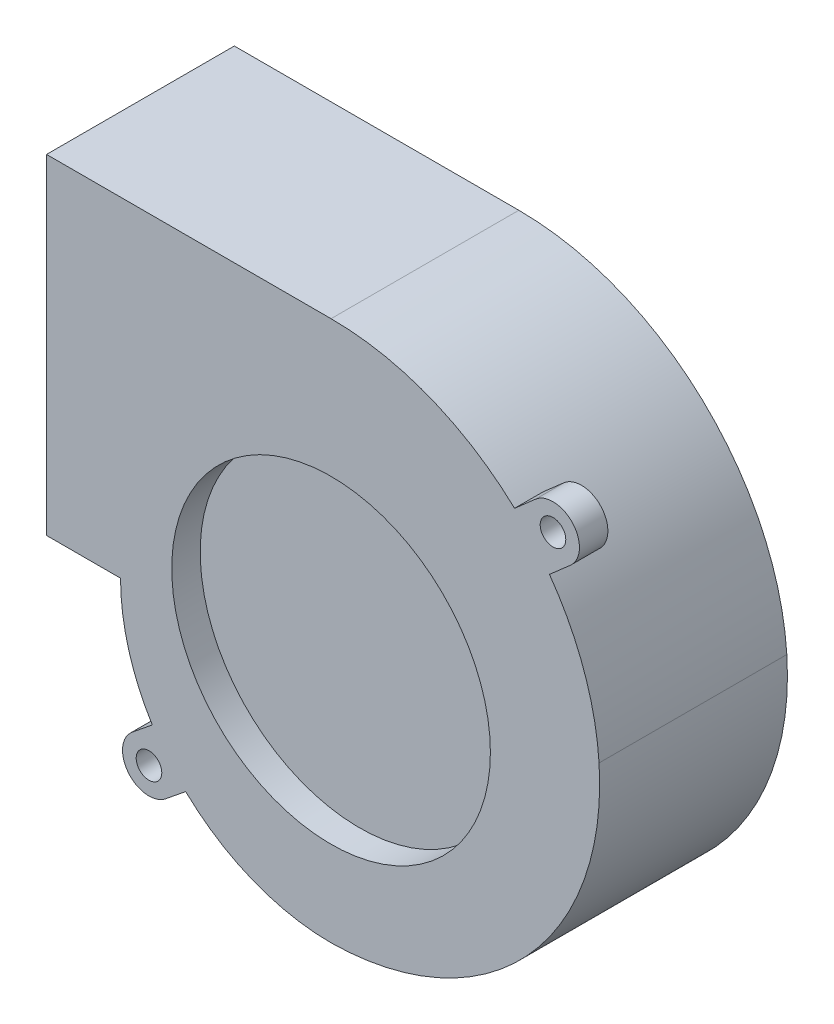
ISO-10303-21;
HEADER;
FILE_DESCRIPTION(('STEP AP214'),'2;1');
FILE_NAME('part.step','',(''),(''),'','','');
FILE_SCHEMA(('AUTOMOTIVE_DESIGN { 1 0 10303 214 1 1 1 1 }'));
ENDSEC;
DATA;
#1=APPLICATION_CONTEXT('core data for automotive mechanical design processes');
#2=APPLICATION_PROTOCOL_DEFINITION('international standard','automotive_design',2000,#1);
#3=PRODUCT_CONTEXT('',#1,'mechanical');
#4=PRODUCT('Part','Part','',(#3));
#5=PRODUCT_RELATED_PRODUCT_CATEGORY('part','',(#4));
#6=PRODUCT_DEFINITION_FORMATION('','',#4);
#7=PRODUCT_DEFINITION_CONTEXT('part definition',#1,'design');
#8=PRODUCT_DEFINITION('design','',#6,#7);
#9=PRODUCT_DEFINITION_SHAPE('','',#8);
#10=(LENGTH_UNIT() NAMED_UNIT(*) SI_UNIT(.MILLI.,.METRE.));
#11=(NAMED_UNIT(*) PLANE_ANGLE_UNIT() SI_UNIT($,.RADIAN.));
#12=(NAMED_UNIT(*) SI_UNIT($,.STERADIAN.) SOLID_ANGLE_UNIT());
#13=UNCERTAINTY_MEASURE_WITH_UNIT(LENGTH_MEASURE(1.E-05),#10,'distance_accuracy_value','');
#14=(GEOMETRIC_REPRESENTATION_CONTEXT(3) GLOBAL_UNCERTAINTY_ASSIGNED_CONTEXT((#13)) GLOBAL_UNIT_ASSIGNED_CONTEXT((#10,
#11,#12)) REPRESENTATION_CONTEXT('',''));
#15=CARTESIAN_POINT('',(0.,0.,0.));
#16=DIRECTION('',(0.,0.,1.));
#17=DIRECTION('',(1.,0.,0.));
#18=AXIS2_PLACEMENT_3D('',#15,#16,#17);
#19=CARTESIAN_POINT('',(0.,0.,-5.));
#20=DIRECTION('',(0.,0.,1.));
#21=DIRECTION('',(1.,0.,0.));
#22=AXIS2_PLACEMENT_3D('',#19,#20,#21);
#23=PLANE('',#22);
#24=CARTESIAN_POINT('',(-32.,-32.,-5.));
#25=DIRECTION('',(0.,0.,1.));
#26=DIRECTION('',(1.,0.,0.));
#27=AXIS2_PLACEMENT_3D('',#24,#25,#26);
#28=CIRCLE('',#27,2.25);
#29=CARTESIAN_POINT('',(-29.75,-32.,-5.));
#30=VERTEX_POINT('',#29);
#31=EDGE_CURVE('E164',#30,#30,#28,.T.);
#32=ORIENTED_EDGE('',*,*,#31,.T.);
#33=EDGE_LOOP('',(#32));
#34=FACE_BOUND('',#33,.T.);
#35=CARTESIAN_POINT('',(0.,-6.00000000000001,-5.));
#36=DIRECTION('',(0.,0.,-1.));
#37=DIRECTION('',(-1.,0.,0.));
#38=AXIS2_PLACEMENT_3D('',#35,#36,#37);
#39=CIRCLE('',#38,37.);
#40=CARTESIAN_POINT('',(-25.556282339339,-32.7558672629386,-5.));
#41=VERTEX_POINT('',#40);
#42=CARTESIAN_POINT('',(-31.4207937527175,-25.5380070618573,-5.));
#43=VERTEX_POINT('',#42);
#44=EDGE_CURVE('E11',#41,#43,#39,.T.);
#45=ORIENTED_EDGE('',*,*,#44,.F.);
#46=DIRECTION('',(0.776114000116265,0.630592625094466,0.));
#47=VECTOR('',#46,1.);
#48=CARTESIAN_POINT('',(5.86872629492454,-7.22304774759942,-5.));
#49=LINE('',#48,#47);
#50=CARTESIAN_POINT('',(-29.0677442933107,-35.6089301005406,-5.));
#51=VERTEX_POINT('',#50);
#52=EDGE_CURVE('E138',#51,#41,#49,.T.);
#53=ORIENTED_EDGE('',*,*,#52,.F.);
#54=CARTESIAN_POINT('',(-32.,-32.,-5.));
#55=DIRECTION('',(0.,0.,1.));
#56=DIRECTION('',(1.,0.,0.));
#57=AXIS2_PLACEMENT_3D('',#54,#55,#56);
#58=CIRCLE('',#57,4.65);
#59=CARTESIAN_POINT('',(-34.9322557066893,-28.3910698994594,-5.));
#60=VERTEX_POINT('',#59);
#61=EDGE_CURVE('E150',#60,#51,#58,.T.);
#62=ORIENTED_EDGE('',*,*,#61,.F.);
#63=DIRECTION('',(0.776114000116266,0.630592625094465,0.));
#64=VECTOR('',#63,1.);
#65=CARTESIAN_POINT('',(0.00421488154604474,-0.00518754651820892,-5.));
#66=LINE('',#65,#64);
#67=EDGE_CURVE('E156',#60,#43,#66,.T.);
#68=ORIENTED_EDGE('',*,*,#67,.T.);
#69=EDGE_LOOP('',(#45,#53,#62,#68));
#70=FACE_BOUND('',#69,.T.);
#71=ADVANCED_FACE('F33',(#34,#70),#23,.F.);
#72=CARTESIAN_POINT('',(39.,39.,-5.));
#73=DIRECTION('',(0.,0.,1.));
#74=DIRECTION('',(1.,0.,0.));
#75=AXIS2_PLACEMENT_3D('',#72,#73,#74);
#76=CIRCLE('',#75,2.25);
#77=CARTESIAN_POINT('',(41.25,39.,-5.));
#78=VERTEX_POINT('',#77);
#79=EDGE_CURVE('E212',#78,#78,#76,.T.);
#80=ORIENTED_EDGE('',*,*,#79,.T.);
#81=EDGE_LOOP('',(#80));
#82=FACE_BOUND('',#81,.T.);
#83=CARTESIAN_POINT('',(0.,4.79565872530256,-5.));
#84=DIRECTION('',(0.,0.,-1.));
#85=DIRECTION('',(-1.,0.,0.));
#86=AXIS2_PLACEMENT_3D('',#83,#84,#85);
#87=CIRCLE('',#86,47.2043412746974);
#88=CARTESIAN_POINT('',(32.2504018785675,39.2653760703722,-5.));
#89=VERTEX_POINT('',#88);
#90=CARTESIAN_POINT('',(38.3825469053457,32.273466648007,-5.));
#91=VERTEX_POINT('',#90);
#92=EDGE_CURVE('E42',#89,#91,#87,.T.);
#93=ORIENTED_EDGE('',*,*,#92,.F.);
#94=DIRECTION('',(0.751818217458621,0.659370432986907,0.));
#95=VECTOR('',#94,1.);
#96=CARTESIAN_POINT('',(-5.44340860474511,6.20660792383399,-5.));
#97=LINE('',#96,#95);
#98=CARTESIAN_POINT('',(35.9339274866109,42.4959547111826,-5.));
#99=VERTEX_POINT('',#98);
#100=EDGE_CURVE('E158',#89,#99,#97,.T.);
#101=ORIENTED_EDGE('',*,*,#100,.T.);
#102=CARTESIAN_POINT('',(39.,39.,-5.));
#103=DIRECTION('',(0.,0.,1.));
#104=DIRECTION('',(1.,0.,0.));
#105=AXIS2_PLACEMENT_3D('',#102,#103,#104);
#106=CIRCLE('',#105,4.65000000000001);
#107=CARTESIAN_POINT('',(42.0660725133891,35.5040452888174,-5.));
#108=VERTEX_POINT('',#107);
#109=EDGE_CURVE('E271',#108,#99,#106,.T.);
#110=ORIENTED_EDGE('',*,*,#109,.F.);
#111=DIRECTION('',(0.751818217458624,0.659370432986904,0.));
#112=VECTOR('',#111,1.);
#113=CARTESIAN_POINT('',(0.688736422032994,-0.78530149853104,-5.));
#114=LINE('',#113,#112);
#115=EDGE_CURVE('E238',#91,#108,#114,.T.);
#116=ORIENTED_EDGE('',*,*,#115,.F.);
#117=EDGE_LOOP('',(#93,#101,#110,#116));
#118=FACE_BOUND('',#117,.T.);
#119=ADVANCED_FACE('F274',(#82,#118),#23,.F.);
#120=CARTESIAN_POINT('',(0.688736422032994,-0.78530149853104,-5.));
#121=DIRECTION('',(0.659370432986904,-0.751818217458624,0.));
#122=DIRECTION('',(0.751818217458624,0.659370432986904,0.));
#123=AXIS2_PLACEMENT_3D('',#120,#121,#122);
#124=PLANE('',#123);
#125=DIRECTION('',(0.751818217458624,0.659370432986904,0.));
#126=VECTOR('',#125,1.);
#127=CARTESIAN_POINT('',(0.688736422032994,-0.78530149853104,0.));
#128=LINE('',#127,#126);
#129=CARTESIAN_POINT('',(38.3825469053457,32.273466648007,0.));
#130=VERTEX_POINT('',#129);
#131=CARTESIAN_POINT('',(42.0660725133891,35.5040452888174,0.));
#132=VERTEX_POINT('',#131);
#133=EDGE_CURVE('E170',#130,#132,#128,.T.);
#134=ORIENTED_EDGE('',*,*,#133,.F.);
#135=DIRECTION('',(0.,0.,1.));
#136=VECTOR('',#135,1.);
#137=CARTESIAN_POINT('',(38.3825469053457,32.273466648007,-5.));
#138=LINE('',#137,#136);
#139=EDGE_CURVE('E59',#91,#130,#138,.T.);
#140=ORIENTED_EDGE('',*,*,#139,.F.);
#141=ORIENTED_EDGE('',*,*,#115,.T.);
#142=DIRECTION('',(0.,0.,1.));
#143=VECTOR('',#142,1.);
#144=CARTESIAN_POINT('',(42.0660725133891,35.5040452888174,-5.));
#145=LINE('',#144,#143);
#146=EDGE_CURVE('E37',#108,#132,#145,.T.);
#147=ORIENTED_EDGE('',*,*,#146,.T.);
#148=EDGE_LOOP('',(#134,#140,#141,#147));
#149=FACE_BOUND('',#148,.T.);
#150=ADVANCED_FACE('F237',(#149),#124,.T.);
#151=CARTESIAN_POINT('',(0.,4.79565872530256,-5.));
#152=DIRECTION('',(0.,0.,1.));
#153=DIRECTION('',(1.,0.,0.));
#154=AXIS2_PLACEMENT_3D('',#151,#152,#153);
#155=CYLINDRICAL_SURFACE('',#154,47.2043412746974);
#156=CARTESIAN_POINT('',(0.,4.79565872530256,0.));
#157=DIRECTION('',(0.,0.,1.));
#158=DIRECTION('',(1.,0.,0.));
#159=AXIS2_PLACEMENT_3D('',#156,#157,#158);
#160=CIRCLE('',#159,47.2043412746974);
#161=CARTESIAN_POINT('',(47.1,7.93250988181384,0.));
#162=VERTEX_POINT('',#161);
#163=EDGE_CURVE('E184',#130,#162,#160,.F.);
#164=ORIENTED_EDGE('',*,*,#163,.T.);
#165=DIRECTION('',(0.,0.,1.));
#166=VECTOR('',#165,1.);
#167=CARTESIAN_POINT('',(47.1,7.93250988181384,-5.));
#168=LINE('',#167,#166);
#169=CARTESIAN_POINT('',(47.1,7.93250988181385,-33.));
#170=VERTEX_POINT('',#169);
#171=EDGE_CURVE('E214',#170,#162,#168,.T.);
#172=ORIENTED_EDGE('',*,*,#171,.F.);
#173=CARTESIAN_POINT('',(0.,4.79565872530256,-33.));
#174=DIRECTION('',(0.,0.,-1.));
#175=DIRECTION('',(-1.,0.,0.));
#176=AXIS2_PLACEMENT_3D('',#173,#174,#175);
#177=CIRCLE('',#176,47.2043412746974);
#178=CARTESIAN_POINT('',(0.,52.,-33.));
#179=VERTEX_POINT('',#178);
#180=EDGE_CURVE('E249',#179,#170,#177,.T.);
#181=ORIENTED_EDGE('',*,*,#180,.F.);
#182=DIRECTION('',(0.,0.,1.));
#183=VECTOR('',#182,1.);
#184=CARTESIAN_POINT('',(0.,52.,-5.));
#185=LINE('',#184,#183);
#186=CARTESIAN_POINT('',(0.,52.,0.));
#187=VERTEX_POINT('',#186);
#188=EDGE_CURVE('E231',#179,#187,#185,.T.);
#189=ORIENTED_EDGE('',*,*,#188,.T.);
#190=CARTESIAN_POINT('',(32.2504018785675,39.2653760703722,0.));
#191=VERTEX_POINT('',#190);
#192=EDGE_CURVE('E180',#187,#191,#160,.F.);
#193=ORIENTED_EDGE('',*,*,#192,.T.);
#194=DIRECTION('',(0.,0.,1.));
#195=VECTOR('',#194,1.);
#196=CARTESIAN_POINT('',(32.2504018785675,39.2653760703722,-5.));
#197=LINE('',#196,#195);
#198=EDGE_CURVE('E233',#89,#191,#197,.T.);
#199=ORIENTED_EDGE('',*,*,#198,.F.);
#200=ORIENTED_EDGE('',*,*,#92,.T.);
#201=ORIENTED_EDGE('',*,*,#139,.T.);
#202=EDGE_LOOP('',(#164,#172,#181,#189,#193,#199,#200,#201));
#203=FACE_BOUND('',#202,.T.);
#204=ADVANCED_FACE('F244',(#203),#155,.T.);
#205=CARTESIAN_POINT('',(-0.556276751296022,4.75861079811266,-5.));
#206=DIRECTION('',(0.,0.,1.));
#207=DIRECTION('',(1.,0.,0.));
#208=AXIS2_PLACEMENT_3D('',#205,#206,#207);
#209=CYLINDRICAL_SURFACE('',#208,47.7618503534948);
#210=CARTESIAN_POINT('',(-0.556276751296022,4.75861079811266,0.));
#211=DIRECTION('',(0.,0.,1.));
#212=DIRECTION('',(1.,0.,0.));
#213=AXIS2_PLACEMENT_3D('',#210,#211,#212);
#214=CIRCLE('',#213,47.7618503534948);
#215=CARTESIAN_POINT('',(0.,-43.,0.));
#216=VERTEX_POINT('',#215);
#217=EDGE_CURVE('E203',#162,#216,#214,.F.);
#218=ORIENTED_EDGE('',*,*,#217,.T.);
#219=DIRECTION('',(0.,0.,1.));
#220=VECTOR('',#219,1.);
#221=CARTESIAN_POINT('',(0.,-43.,-5.));
#222=LINE('',#221,#220);
#223=CARTESIAN_POINT('',(0.,-43.,-33.));
#224=VERTEX_POINT('',#223);
#225=EDGE_CURVE('E217',#224,#216,#222,.T.);
#226=ORIENTED_EDGE('',*,*,#225,.F.);
#227=CARTESIAN_POINT('',(-0.556276751296022,4.75861079811266,-33.));
#228=DIRECTION('',(0.,0.,-1.));
#229=DIRECTION('',(-1.,0.,0.));
#230=AXIS2_PLACEMENT_3D('',#227,#228,#229);
#231=CIRCLE('',#230,47.7618503534948);
#232=EDGE_CURVE('E171',#170,#224,#231,.T.);
#233=ORIENTED_EDGE('',*,*,#232,.F.);
#234=ORIENTED_EDGE('',*,*,#171,.T.);
#235=EDGE_LOOP('',(#218,#226,#233,#234));
#236=FACE_BOUND('',#235,.T.);
#237=ADVANCED_FACE('F263',(#236),#209,.T.);
#238=CARTESIAN_POINT('',(0.,-6.00000000000001,-5.));
#239=DIRECTION('',(0.,0.,1.));
#240=DIRECTION('',(1.,0.,0.));
#241=AXIS2_PLACEMENT_3D('',#238,#239,#240);
#242=CYLINDRICAL_SURFACE('',#241,37.);
#243=CARTESIAN_POINT('',(0.,-6.00000000000001,0.));
#244=DIRECTION('',(0.,0.,1.));
#245=DIRECTION('',(1.,0.,0.));
#246=AXIS2_PLACEMENT_3D('',#243,#244,#245);
#247=CIRCLE('',#246,37.);
#248=CARTESIAN_POINT('',(-25.556282339339,-32.7558672629386,0.));
#249=VERTEX_POINT('',#248);
#250=EDGE_CURVE('E197',#216,#249,#247,.F.);
#251=ORIENTED_EDGE('',*,*,#250,.T.);
#252=DIRECTION('',(0.,0.,1.));
#253=VECTOR('',#252,1.);
#254=CARTESIAN_POINT('',(-25.556282339339,-32.7558672629386,-5.));
#255=LINE('',#254,#253);
#256=EDGE_CURVE('E145',#41,#249,#255,.T.);
#257=ORIENTED_EDGE('',*,*,#256,.F.);
#258=ORIENTED_EDGE('',*,*,#44,.T.);
#259=DIRECTION('',(0.,0.,1.));
#260=VECTOR('',#259,1.);
#261=CARTESIAN_POINT('',(-31.4207937527175,-25.5380070618573,-5.));
#262=LINE('',#261,#260);
#263=CARTESIAN_POINT('',(-31.4207937527175,-25.5380070618573,0.));
#264=VERTEX_POINT('',#263);
#265=EDGE_CURVE('E222',#43,#264,#262,.T.);
#266=ORIENTED_EDGE('',*,*,#265,.T.);
#267=CARTESIAN_POINT('',(-37.,-6.00000000000001,0.));
#268=VERTEX_POINT('',#267);
#269=EDGE_CURVE('E193',#264,#268,#247,.F.);
#270=ORIENTED_EDGE('',*,*,#269,.T.);
#271=DIRECTION('',(0.,0.,1.));
#272=VECTOR('',#271,1.);
#273=CARTESIAN_POINT('',(-37.,-6.00000000000001,-5.));
#274=LINE('',#273,#272);
#275=CARTESIAN_POINT('',(-37.,-6.00000000000001,-33.));
#276=VERTEX_POINT('',#275);
#277=EDGE_CURVE('E225',#276,#268,#274,.T.);
#278=ORIENTED_EDGE('',*,*,#277,.F.);
#279=CARTESIAN_POINT('',(0.,-6.00000000000001,-33.));
#280=DIRECTION('',(0.,0.,-1.));
#281=DIRECTION('',(-1.,0.,0.));
#282=AXIS2_PLACEMENT_3D('',#279,#280,#281);
#283=CIRCLE('',#282,37.);
#284=EDGE_CURVE('E306',#224,#276,#283,.T.);
#285=ORIENTED_EDGE('',*,*,#284,.F.);
#286=ORIENTED_EDGE('',*,*,#225,.T.);
#287=EDGE_LOOP('',(#251,#257,#258,#266,#270,#278,#285,#286));
#288=FACE_BOUND('',#287,.T.);
#289=ADVANCED_FACE('F302',(#288),#242,.T.);
#290=CARTESIAN_POINT('',(5.86872629492454,-7.22304774759942,-5.));
#291=DIRECTION('',(0.630592625094466,-0.776114000116265,0.));
#292=DIRECTION('',(0.776114000116265,0.630592625094466,0.));
#293=AXIS2_PLACEMENT_3D('',#290,#291,#292);
#294=PLANE('',#293);
#295=DIRECTION('',(0.776114000116265,0.630592625094466,0.));
#296=VECTOR('',#295,1.);
#297=CARTESIAN_POINT('',(5.86872629492454,-7.22304774759942,0.));
#298=LINE('',#297,#296);
#299=CARTESIAN_POINT('',(-29.0677442933107,-35.6089301005406,0.));
#300=VERTEX_POINT('',#299);
#301=EDGE_CURVE('E140',#300,#249,#298,.T.);
#302=ORIENTED_EDGE('',*,*,#301,.F.);
#303=DIRECTION('',(0.,0.,1.));
#304=VECTOR('',#303,1.);
#305=CARTESIAN_POINT('',(-29.0677442933107,-35.6089301005406,-5.));
#306=LINE('',#305,#304);
#307=EDGE_CURVE('E135',#51,#300,#306,.T.);
#308=ORIENTED_EDGE('',*,*,#307,.F.);
#309=ORIENTED_EDGE('',*,*,#52,.T.);
#310=ORIENTED_EDGE('',*,*,#256,.T.);
#311=EDGE_LOOP('',(#302,#308,#309,#310));
#312=FACE_BOUND('',#311,.T.);
#313=ADVANCED_FACE('F137',(#312),#294,.T.);
#314=CARTESIAN_POINT('',(-32.,-32.,-5.));
#315=DIRECTION('',(0.,0.,1.));
#316=DIRECTION('',(1.,0.,0.));
#317=AXIS2_PLACEMENT_3D('',#314,#315,#316);
#318=CYLINDRICAL_SURFACE('',#317,4.65);
#319=CARTESIAN_POINT('',(-32.,-32.,0.));
#320=DIRECTION('',(0.,0.,1.));
#321=DIRECTION('',(1.,0.,0.));
#322=AXIS2_PLACEMENT_3D('',#319,#320,#321);
#323=CIRCLE('',#322,4.65);
#324=CARTESIAN_POINT('',(-34.9322557066893,-28.3910698994594,0.));
#325=VERTEX_POINT('',#324);
#326=EDGE_CURVE('E200',#325,#300,#323,.T.);
#327=ORIENTED_EDGE('',*,*,#326,.F.);
#328=DIRECTION('',(0.,0.,1.));
#329=VECTOR('',#328,1.);
#330=CARTESIAN_POINT('',(-34.9322557066893,-28.3910698994594,-5.));
#331=LINE('',#330,#329);
#332=EDGE_CURVE('E146',#60,#325,#331,.T.);
#333=ORIENTED_EDGE('',*,*,#332,.F.);
#334=ORIENTED_EDGE('',*,*,#61,.T.);
#335=ORIENTED_EDGE('',*,*,#307,.T.);
#336=EDGE_LOOP('',(#327,#333,#334,#335));
#337=FACE_BOUND('',#336,.T.);
#338=ADVANCED_FACE('F154',(#337),#318,.T.);
#339=CARTESIAN_POINT('',(0.00421488154604474,-0.00518754651820892,-5.));
#340=DIRECTION('',(0.630592625094465,-0.776114000116266,0.));
#341=DIRECTION('',(0.776114000116266,0.630592625094465,0.));
#342=AXIS2_PLACEMENT_3D('',#339,#340,#341);
#343=PLANE('',#342);
#344=DIRECTION('',(0.776114000116266,0.630592625094465,0.));
#345=VECTOR('',#344,1.);
#346=CARTESIAN_POINT('',(0.00421488154604474,-0.00518754651820892,0.));
#347=LINE('',#346,#345);
#348=EDGE_CURVE('E196',#325,#264,#347,.T.);
#349=ORIENTED_EDGE('',*,*,#348,.T.);
#350=ORIENTED_EDGE('',*,*,#265,.F.);
#351=ORIENTED_EDGE('',*,*,#67,.F.);
#352=ORIENTED_EDGE('',*,*,#332,.T.);
#353=EDGE_LOOP('',(#349,#350,#351,#352));
#354=FACE_BOUND('',#353,.T.);
#355=ADVANCED_FACE('F305',(#354),#343,.F.);
#356=CARTESIAN_POINT('',(0.,-6.00000000000002,-5.));
#357=DIRECTION('',(0.,-1.,0.));
#358=DIRECTION('',(1.,0.,0.));
#359=AXIS2_PLACEMENT_3D('',#356,#357,#358);
#360=PLANE('',#359);
#361=DIRECTION('',(1.,0.,0.));
#362=VECTOR('',#361,1.);
#363=CARTESIAN_POINT('',(0.,-6.00000000000002,0.));
#364=LINE('',#363,#362);
#365=CARTESIAN_POINT('',(-50.,-6.00000000000001,0.));
#366=VERTEX_POINT('',#365);
#367=EDGE_CURVE('E190',#366,#268,#364,.T.);
#368=ORIENTED_EDGE('',*,*,#367,.F.);
#369=DIRECTION('',(0.,0.,1.));
#370=VECTOR('',#369,1.);
#371=CARTESIAN_POINT('',(-50.,-6.00000000000001,-5.));
#372=LINE('',#371,#370);
#373=CARTESIAN_POINT('',(-50.,-6.00000000000001,-33.));
#374=VERTEX_POINT('',#373);
#375=EDGE_CURVE('E227',#374,#366,#372,.T.);
#376=ORIENTED_EDGE('',*,*,#375,.F.);
#377=DIRECTION('',(-1.,0.,0.));
#378=VECTOR('',#377,1.);
#379=CARTESIAN_POINT('',(0.,-6.00000000000002,-33.));
#380=LINE('',#379,#378);
#381=EDGE_CURVE('E299',#276,#374,#380,.T.);
#382=ORIENTED_EDGE('',*,*,#381,.F.);
#383=ORIENTED_EDGE('',*,*,#277,.T.);
#384=EDGE_LOOP('',(#368,#376,#382,#383));
#385=FACE_BOUND('',#384,.T.);
#386=ADVANCED_FACE('F293',(#385),#360,.T.);
#387=CARTESIAN_POINT('',(-50.,0.,-5.));
#388=DIRECTION('',(-1.,0.,0.));
#389=DIRECTION('',(0.,-1.,0.));
#390=AXIS2_PLACEMENT_3D('',#387,#388,#389);
#391=PLANE('',#390);
#392=DIRECTION('',(0.,0.,-1.));
#393=VECTOR('',#392,1.);
#394=CARTESIAN_POINT('',(-50.,50.5,-1.5));
#395=LINE('',#394,#393);
#396=CARTESIAN_POINT('',(-50.,50.5,-1.5));
#397=VERTEX_POINT('',#396);
#398=CARTESIAN_POINT('',(-50.,50.5,-31.5));
#399=VERTEX_POINT('',#398);
#400=EDGE_CURVE('E50',#397,#399,#395,.T.);
#401=ORIENTED_EDGE('',*,*,#400,.F.);
#402=DIRECTION('',(0.,1.,0.));
#403=VECTOR('',#402,1.);
#404=CARTESIAN_POINT('',(-50.,-4.50000000000001,-1.5));
#405=LINE('',#404,#403);
#406=CARTESIAN_POINT('',(-50.,-4.50000000000001,-1.5));
#407=VERTEX_POINT('',#406);
#408=EDGE_CURVE('E361',#407,#397,#405,.T.);
#409=ORIENTED_EDGE('',*,*,#408,.F.);
#410=DIRECTION('',(0.,0.,1.));
#411=VECTOR('',#410,1.);
#412=CARTESIAN_POINT('',(-50.,-4.5,-31.5));
#413=LINE('',#412,#411);
#414=CARTESIAN_POINT('',(-50.,-4.5,-31.5));
#415=VERTEX_POINT('',#414);
#416=EDGE_CURVE('E364',#415,#407,#413,.T.);
#417=ORIENTED_EDGE('',*,*,#416,.F.);
#418=DIRECTION('',(0.,-1.,0.));
#419=VECTOR('',#418,1.);
#420=CARTESIAN_POINT('',(-50.,50.5,-31.5));
#421=LINE('',#420,#419);
#422=EDGE_CURVE('E370',#399,#415,#421,.T.);
#423=ORIENTED_EDGE('',*,*,#422,.F.);
#424=EDGE_LOOP('',(#401,#409,#417,#423));
#425=FACE_BOUND('',#424,.T.);
#426=DIRECTION('',(0.,-1.,0.));
#427=VECTOR('',#426,1.);
#428=CARTESIAN_POINT('',(-50.,0.,0.));
#429=LINE('',#428,#427);
#430=CARTESIAN_POINT('',(-50.,52.,0.));
#431=VERTEX_POINT('',#430);
#432=EDGE_CURVE('E187',#431,#366,#429,.T.);
#433=ORIENTED_EDGE('',*,*,#432,.F.);
#434=DIRECTION('',(0.,0.,1.));
#435=VECTOR('',#434,1.);
#436=CARTESIAN_POINT('',(-50.,52.,-5.));
#437=LINE('',#436,#435);
#438=CARTESIAN_POINT('',(-50.,52.,-33.));
#439=VERTEX_POINT('',#438);
#440=EDGE_CURVE('E229',#439,#431,#437,.T.);
#441=ORIENTED_EDGE('',*,*,#440,.F.);
#442=DIRECTION('',(0.,1.,0.));
#443=VECTOR('',#442,1.);
#444=CARTESIAN_POINT('',(-50.,0.,-33.));
#445=LINE('',#444,#443);
#446=EDGE_CURVE('E309',#374,#439,#445,.T.);
#447=ORIENTED_EDGE('',*,*,#446,.F.);
#448=ORIENTED_EDGE('',*,*,#375,.T.);
#449=EDGE_LOOP('',(#433,#441,#447,#448));
#450=FACE_BOUND('',#449,.T.);
#451=ADVANCED_FACE('F288',(#425,#450),#391,.T.);
#452=CARTESIAN_POINT('',(0.,52.,-5.));
#453=DIRECTION('',(0.,1.,0.));
#454=DIRECTION('',(-1.,0.,0.));
#455=AXIS2_PLACEMENT_3D('',#452,#453,#454);
#456=PLANE('',#455);
#457=DIRECTION('',(-1.,0.,0.));
#458=VECTOR('',#457,1.);
#459=CARTESIAN_POINT('',(0.,52.,0.));
#460=LINE('',#459,#458);
#461=EDGE_CURVE('E183',#187,#431,#460,.T.);
#462=ORIENTED_EDGE('',*,*,#461,.F.);
#463=ORIENTED_EDGE('',*,*,#188,.F.);
#464=DIRECTION('',(1.,0.,0.));
#465=VECTOR('',#464,1.);
#466=CARTESIAN_POINT('',(0.,52.,-33.));
#467=LINE('',#466,#465);
#468=EDGE_CURVE('E260',#439,#179,#467,.T.);
#469=ORIENTED_EDGE('',*,*,#468,.F.);
#470=ORIENTED_EDGE('',*,*,#440,.T.);
#471=EDGE_LOOP('',(#462,#463,#469,#470));
#472=FACE_BOUND('',#471,.T.);
#473=ADVANCED_FACE('F282',(#472),#456,.T.);
#474=CARTESIAN_POINT('',(-5.44340860474511,6.20660792383399,-5.));
#475=DIRECTION('',(0.659370432986907,-0.751818217458621,0.));
#476=DIRECTION('',(0.751818217458621,0.659370432986907,0.));
#477=AXIS2_PLACEMENT_3D('',#474,#475,#476);
#478=PLANE('',#477);
#479=DIRECTION('',(0.751818217458621,0.659370432986907,0.));
#480=VECTOR('',#479,1.);
#481=CARTESIAN_POINT('',(-5.44340860474511,6.20660792383399,0.));
#482=LINE('',#481,#480);
#483=CARTESIAN_POINT('',(35.9339274866109,42.4959547111826,0.));
#484=VERTEX_POINT('',#483);
#485=EDGE_CURVE('E177',#191,#484,#482,.T.);
#486=ORIENTED_EDGE('',*,*,#485,.T.);
#487=DIRECTION('',(0.,0.,1.));
#488=VECTOR('',#487,1.);
#489=CARTESIAN_POINT('',(35.9339274866109,42.4959547111826,-5.));
#490=LINE('',#489,#488);
#491=EDGE_CURVE('E235',#99,#484,#490,.T.);
#492=ORIENTED_EDGE('',*,*,#491,.F.);
#493=ORIENTED_EDGE('',*,*,#100,.F.);
#494=ORIENTED_EDGE('',*,*,#198,.T.);
#495=EDGE_LOOP('',(#486,#492,#493,#494));
#496=FACE_BOUND('',#495,.T.);
#497=ADVANCED_FACE('F277',(#496),#478,.F.);
#498=CARTESIAN_POINT('',(0.,0.,-5.));
#499=DIRECTION('',(0.,0.,1.));
#500=DIRECTION('',(1.,0.,0.));
#501=AXIS2_PLACEMENT_3D('',#498,#499,#500);
#502=CYLINDRICAL_SURFACE('',#501,28.);
#503=CARTESIAN_POINT('',(0.,0.,-5.));
#504=DIRECTION('',(0.,0.,1.));
#505=DIRECTION('',(1.,0.,0.));
#506=AXIS2_PLACEMENT_3D('',#503,#504,#505);
#507=CIRCLE('',#506,28.);
#508=CARTESIAN_POINT('',(28.,0.,-5.));
#509=VERTEX_POINT('',#508);
#510=EDGE_CURVE('E152',#509,#509,#507,.T.);
#511=ORIENTED_EDGE('',*,*,#510,.F.);
#512=EDGE_LOOP('',(#511));
#513=FACE_BOUND('',#512,.T.);
#514=CARTESIAN_POINT('',(0.,0.,0.));
#515=DIRECTION('',(0.,0.,1.));
#516=DIRECTION('',(1.,0.,0.));
#517=AXIS2_PLACEMENT_3D('',#514,#515,#516);
#518=CIRCLE('',#517,28.);
#519=CARTESIAN_POINT('',(28.,0.,0.));
#520=VERTEX_POINT('',#519);
#521=EDGE_CURVE('E206',#520,#520,#518,.T.);
#522=ORIENTED_EDGE('',*,*,#521,.T.);
#523=EDGE_LOOP('',(#522));
#524=FACE_BOUND('',#523,.T.);
#525=ADVANCED_FACE('F408',(#513,#524),#502,.F.);
#526=CARTESIAN_POINT('',(39.,39.,-5.));
#527=DIRECTION('',(0.,0.,1.));
#528=DIRECTION('',(1.,0.,0.));
#529=AXIS2_PLACEMENT_3D('',#526,#527,#528);
#530=CYLINDRICAL_SURFACE('',#529,4.65000000000001);
#531=CARTESIAN_POINT('',(39.,39.,0.));
#532=DIRECTION('',(0.,0.,1.));
#533=DIRECTION('',(1.,0.,0.));
#534=AXIS2_PLACEMENT_3D('',#531,#532,#533);
#535=CIRCLE('',#534,4.65000000000001);
#536=EDGE_CURVE('E174',#132,#484,#535,.T.);
#537=ORIENTED_EDGE('',*,*,#536,.F.);
#538=ORIENTED_EDGE('',*,*,#146,.F.);
#539=ORIENTED_EDGE('',*,*,#109,.T.);
#540=ORIENTED_EDGE('',*,*,#491,.T.);
#541=EDGE_LOOP('',(#537,#538,#539,#540));
#542=FACE_BOUND('',#541,.T.);
#543=ADVANCED_FACE('F239',(#542),#530,.T.);
#544=CARTESIAN_POINT('',(39.,39.,-5.));
#545=DIRECTION('',(0.,0.,1.));
#546=DIRECTION('',(1.,0.,0.));
#547=AXIS2_PLACEMENT_3D('',#544,#545,#546);
#548=CYLINDRICAL_SURFACE('',#547,2.25);
#549=ORIENTED_EDGE('',*,*,#79,.F.);
#550=EDGE_LOOP('',(#549));
#551=FACE_BOUND('',#550,.T.);
#552=CARTESIAN_POINT('',(39.,39.,0.));
#553=DIRECTION('',(0.,0.,1.));
#554=DIRECTION('',(1.,0.,0.));
#555=AXIS2_PLACEMENT_3D('',#552,#553,#554);
#556=CIRCLE('',#555,2.25);
#557=CARTESIAN_POINT('',(41.25,39.,0.));
#558=VERTEX_POINT('',#557);
#559=EDGE_CURVE('E167',#558,#558,#556,.T.);
#560=ORIENTED_EDGE('',*,*,#559,.T.);
#561=EDGE_LOOP('',(#560));
#562=FACE_BOUND('',#561,.T.);
#563=ADVANCED_FACE('F35',(#551,#562),#548,.F.);
#564=CARTESIAN_POINT('',(-32.,-32.,-5.));
#565=DIRECTION('',(0.,0.,1.));
#566=DIRECTION('',(1.,0.,0.));
#567=AXIS2_PLACEMENT_3D('',#564,#565,#566);
#568=CYLINDRICAL_SURFACE('',#567,2.25);
#569=ORIENTED_EDGE('',*,*,#31,.F.);
#570=EDGE_LOOP('',(#569));
#571=FACE_BOUND('',#570,.T.);
#572=CARTESIAN_POINT('',(-32.,-32.,0.));
#573=DIRECTION('',(0.,0.,1.));
#574=DIRECTION('',(1.,0.,0.));
#575=AXIS2_PLACEMENT_3D('',#572,#573,#574);
#576=CIRCLE('',#575,2.25);
#577=CARTESIAN_POINT('',(-29.75,-32.,0.));
#578=VERTEX_POINT('',#577);
#579=EDGE_CURVE('E209',#578,#578,#576,.T.);
#580=ORIENTED_EDGE('',*,*,#579,.T.);
#581=EDGE_LOOP('',(#580));
#582=FACE_BOUND('',#581,.T.);
#583=ADVANCED_FACE('F403',(#571,#582),#568,.F.);
#584=CARTESIAN_POINT('',(0.,0.,0.));
#585=DIRECTION('',(0.,0.,1.));
#586=DIRECTION('',(1.,0.,0.));
#587=AXIS2_PLACEMENT_3D('',#584,#585,#586);
#588=PLANE('',#587);
#589=ORIENTED_EDGE('',*,*,#559,.F.);
#590=EDGE_LOOP('',(#589));
#591=FACE_BOUND('',#590,.T.);
#592=ORIENTED_EDGE('',*,*,#133,.T.);
#593=ORIENTED_EDGE('',*,*,#536,.T.);
#594=ORIENTED_EDGE('',*,*,#485,.F.);
#595=ORIENTED_EDGE('',*,*,#192,.F.);
#596=ORIENTED_EDGE('',*,*,#461,.T.);
#597=ORIENTED_EDGE('',*,*,#432,.T.);
#598=ORIENTED_EDGE('',*,*,#367,.T.);
#599=ORIENTED_EDGE('',*,*,#269,.F.);
#600=ORIENTED_EDGE('',*,*,#348,.F.);
#601=ORIENTED_EDGE('',*,*,#326,.T.);
#602=ORIENTED_EDGE('',*,*,#301,.T.);
#603=ORIENTED_EDGE('',*,*,#250,.F.);
#604=ORIENTED_EDGE('',*,*,#217,.F.);
#605=ORIENTED_EDGE('',*,*,#163,.F.);
#606=EDGE_LOOP('',(#592,#593,#594,#595,#596,#597,#598,#599,#600,#601,#602,#603,#604,#605));
#607=FACE_BOUND('',#606,.T.);
#608=ORIENTED_EDGE('',*,*,#521,.F.);
#609=EDGE_LOOP('',(#608));
#610=FACE_BOUND('',#609,.T.);
#611=ORIENTED_EDGE('',*,*,#579,.F.);
#612=EDGE_LOOP('',(#611));
#613=FACE_BOUND('',#612,.T.);
#614=ADVANCED_FACE('F241',(#591,#607,#610,#613),#588,.T.);
#615=CARTESIAN_POINT('',(0.,0.,-33.));
#616=DIRECTION('',(0.,0.,-1.));
#617=DIRECTION('',(-1.,0.,0.));
#618=AXIS2_PLACEMENT_3D('',#615,#616,#617);
#619=PLANE('',#618);
#620=ORIENTED_EDGE('',*,*,#284,.T.);
#621=ORIENTED_EDGE('',*,*,#381,.T.);
#622=ORIENTED_EDGE('',*,*,#446,.T.);
#623=ORIENTED_EDGE('',*,*,#468,.T.);
#624=ORIENTED_EDGE('',*,*,#180,.T.);
#625=ORIENTED_EDGE('',*,*,#232,.T.);
#626=EDGE_LOOP('',(#620,#621,#622,#623,#624,#625));
#627=FACE_BOUND('',#626,.T.);
#628=ADVANCED_FACE('F256',(#627),#619,.T.);
#629=CARTESIAN_POINT('',(0.,0.,-5.));
#630=DIRECTION('',(0.,0.,-1.));
#631=DIRECTION('',(-1.,0.,0.));
#632=AXIS2_PLACEMENT_3D('',#629,#630,#631);
#633=PLANE('',#632);
#634=ORIENTED_EDGE('',*,*,#510,.T.);
#635=EDGE_LOOP('',(#634));
#636=FACE_BOUND('',#635,.T.);
#637=ADVANCED_FACE('F388',(#636),#633,.F.);
#638=CARTESIAN_POINT('',(-30.,50.5,-1.5));
#639=DIRECTION('',(0.,1.,0.));
#640=DIRECTION('',(-1.,0.,0.));
#641=AXIS2_PLACEMENT_3D('',#638,#639,#640);
#642=PLANE('',#641);
#643=ORIENTED_EDGE('',*,*,#400,.T.);
#644=DIRECTION('',(-1.,0.,0.));
#645=VECTOR('',#644,1.);
#646=CARTESIAN_POINT('',(-30.,50.5,-31.5));
#647=LINE('',#646,#645);
#648=CARTESIAN_POINT('',(-30.,50.5,-31.5));
#649=VERTEX_POINT('',#648);
#650=EDGE_CURVE('E314',#649,#399,#647,.T.);
#651=ORIENTED_EDGE('',*,*,#650,.F.);
#652=DIRECTION('',(0.,0.,-1.));
#653=VECTOR('',#652,1.);
#654=CARTESIAN_POINT('',(-30.,50.5,-1.5));
#655=LINE('',#654,#653);
#656=CARTESIAN_POINT('',(-30.,50.5,-1.5));
#657=VERTEX_POINT('',#656);
#658=EDGE_CURVE('E344',#657,#649,#655,.T.);
#659=ORIENTED_EDGE('',*,*,#658,.F.);
#660=DIRECTION('',(-1.,0.,0.));
#661=VECTOR('',#660,1.);
#662=CARTESIAN_POINT('',(-30.,50.5,-1.5));
#663=LINE('',#662,#661);
#664=EDGE_CURVE('E307',#657,#397,#663,.T.);
#665=ORIENTED_EDGE('',*,*,#664,.T.);
#666=EDGE_LOOP('',(#643,#651,#659,#665));
#667=FACE_BOUND('',#666,.T.);
#668=ADVANCED_FACE('F342',(#667),#642,.F.);
#669=CARTESIAN_POINT('',(-30.,-4.50000000000001,-1.5));
#670=DIRECTION('',(0.,0.,1.));
#671=DIRECTION('',(1.,0.,0.));
#672=AXIS2_PLACEMENT_3D('',#669,#670,#671);
#673=PLANE('',#672);
#674=ORIENTED_EDGE('',*,*,#408,.T.);
#675=ORIENTED_EDGE('',*,*,#664,.F.);
#676=DIRECTION('',(0.,1.,0.));
#677=VECTOR('',#676,1.);
#678=CARTESIAN_POINT('',(-30.,-4.50000000000001,-1.5));
#679=LINE('',#678,#677);
#680=CARTESIAN_POINT('',(-30.,-4.50000000000001,-1.5));
#681=VERTEX_POINT('',#680);
#682=EDGE_CURVE('E350',#681,#657,#679,.T.);
#683=ORIENTED_EDGE('',*,*,#682,.F.);
#684=DIRECTION('',(-1.,0.,0.));
#685=VECTOR('',#684,1.);
#686=CARTESIAN_POINT('',(-30.,-4.50000000000001,-1.5));
#687=LINE('',#686,#685);
#688=EDGE_CURVE('E311',#681,#407,#687,.T.);
#689=ORIENTED_EDGE('',*,*,#688,.T.);
#690=EDGE_LOOP('',(#674,#675,#683,#689));
#691=FACE_BOUND('',#690,.T.);
#692=ADVANCED_FACE('F380',(#691),#673,.F.);
#693=CARTESIAN_POINT('',(-30.,-4.5,-31.5));
#694=DIRECTION('',(0.,-1.,0.));
#695=DIRECTION('',(0.,0.,-1.));
#696=AXIS2_PLACEMENT_3D('',#693,#694,#695);
#697=PLANE('',#696);
#698=ORIENTED_EDGE('',*,*,#416,.T.);
#699=ORIENTED_EDGE('',*,*,#688,.F.);
#700=DIRECTION('',(0.,0.,1.));
#701=VECTOR('',#700,1.);
#702=CARTESIAN_POINT('',(-30.,-4.5,-31.5));
#703=LINE('',#702,#701);
#704=CARTESIAN_POINT('',(-30.,-4.5,-31.5));
#705=VERTEX_POINT('',#704);
#706=EDGE_CURVE('E357',#705,#681,#703,.T.);
#707=ORIENTED_EDGE('',*,*,#706,.F.);
#708=DIRECTION('',(-1.,0.,0.));
#709=VECTOR('',#708,1.);
#710=CARTESIAN_POINT('',(-30.,-4.5,-31.5));
#711=LINE('',#710,#709);
#712=EDGE_CURVE('E349',#705,#415,#711,.T.);
#713=ORIENTED_EDGE('',*,*,#712,.T.);
#714=EDGE_LOOP('',(#698,#699,#707,#713));
#715=FACE_BOUND('',#714,.T.);
#716=ADVANCED_FACE('F375',(#715),#697,.F.);
#717=CARTESIAN_POINT('',(-30.,50.5,-31.5));
#718=DIRECTION('',(0.,0.,-1.));
#719=DIRECTION('',(-1.,0.,0.));
#720=AXIS2_PLACEMENT_3D('',#717,#718,#719);
#721=PLANE('',#720);
#722=ORIENTED_EDGE('',*,*,#422,.T.);
#723=ORIENTED_EDGE('',*,*,#712,.F.);
#724=DIRECTION('',(0.,-1.,0.));
#725=VECTOR('',#724,1.);
#726=CARTESIAN_POINT('',(-30.,50.5,-31.5));
#727=LINE('',#726,#725);
#728=EDGE_CURVE('E352',#649,#705,#727,.T.);
#729=ORIENTED_EDGE('',*,*,#728,.F.);
#730=ORIENTED_EDGE('',*,*,#650,.T.);
#731=EDGE_LOOP('',(#722,#723,#729,#730));
#732=FACE_BOUND('',#731,.T.);
#733=ADVANCED_FACE('F353',(#732),#721,.F.);
#734=CARTESIAN_POINT('',(-30.,0.,0.));
#735=DIRECTION('',(-1.,0.,0.));
#736=DIRECTION('',(0.,-1.,0.));
#737=AXIS2_PLACEMENT_3D('',#734,#735,#736);
#738=PLANE('',#737);
#739=ORIENTED_EDGE('',*,*,#658,.T.);
#740=ORIENTED_EDGE('',*,*,#728,.T.);
#741=ORIENTED_EDGE('',*,*,#706,.T.);
#742=ORIENTED_EDGE('',*,*,#682,.T.);
#743=EDGE_LOOP('',(#739,#740,#741,#742));
#744=FACE_BOUND('',#743,.T.);
#745=ADVANCED_FACE('F359',(#744),#738,.T.);
#746=CLOSED_SHELL('',(#71,#119,#150,#204,#237,#289,#313,#338,#355,#386,#451,#473,#497,#525,#543,
#563,#583,#614,#628,#637,#668,#692,#716,#733,#745));
#747=MANIFOLD_SOLID_BREP('B2',#746);
#748=ADVANCED_BREP_SHAPE_REPRESENTATION('',(#18,#747),#14);
#749=SHAPE_DEFINITION_REPRESENTATION(#9,#748);
ENDSEC;
END-ISO-10303-21;
